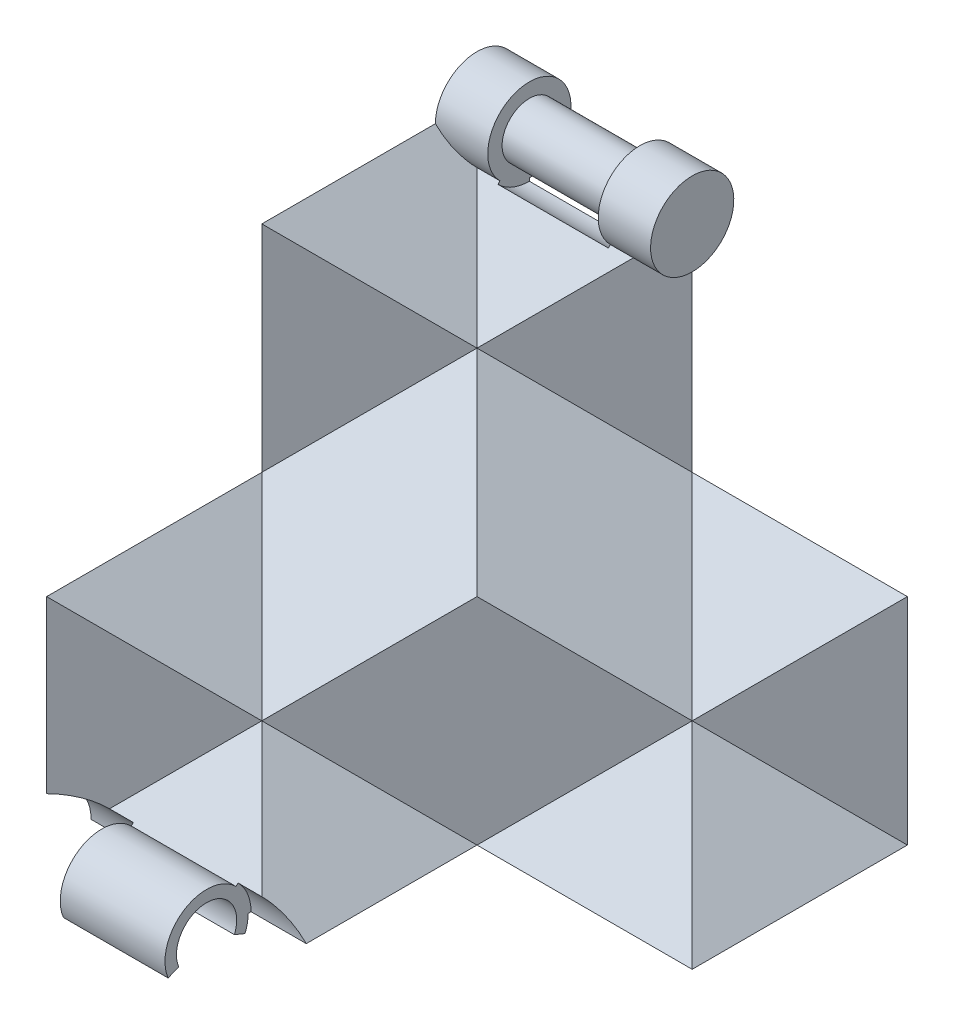
ISO-10303-21;
HEADER;
FILE_DESCRIPTION(('STEP AP214'),'2;1');
FILE_NAME('part.step','',(''),(''),'','','');
FILE_SCHEMA(('AUTOMOTIVE_DESIGN { 1 0 10303 214 1 1 1 1 }'));
ENDSEC;
DATA;
#1=APPLICATION_CONTEXT('core data for automotive mechanical design processes');
#2=APPLICATION_PROTOCOL_DEFINITION('international standard','automotive_design',2000,#1);
#3=PRODUCT_CONTEXT('',#1,'mechanical');
#4=PRODUCT('Part','Part','',(#3));
#5=PRODUCT_RELATED_PRODUCT_CATEGORY('part','',(#4));
#6=PRODUCT_DEFINITION_FORMATION('','',#4);
#7=PRODUCT_DEFINITION_CONTEXT('part definition',#1,'design');
#8=PRODUCT_DEFINITION('design','',#6,#7);
#9=PRODUCT_DEFINITION_SHAPE('','',#8);
#10=(LENGTH_UNIT() NAMED_UNIT(*) SI_UNIT(.MILLI.,.METRE.));
#11=(NAMED_UNIT(*) PLANE_ANGLE_UNIT() SI_UNIT($,.RADIAN.));
#12=(NAMED_UNIT(*) SI_UNIT($,.STERADIAN.) SOLID_ANGLE_UNIT());
#13=UNCERTAINTY_MEASURE_WITH_UNIT(LENGTH_MEASURE(1.E-05),#10,'distance_accuracy_value','');
#14=(GEOMETRIC_REPRESENTATION_CONTEXT(3) GLOBAL_UNCERTAINTY_ASSIGNED_CONTEXT((#13)) GLOBAL_UNIT_ASSIGNED_CONTEXT((#10,
#11,#12)) REPRESENTATION_CONTEXT('',''));
#15=CARTESIAN_POINT('',(0.,0.,0.));
#16=DIRECTION('',(0.,0.,1.));
#17=DIRECTION('',(1.,0.,0.));
#18=AXIS2_PLACEMENT_3D('',#15,#16,#17);
#19=CARTESIAN_POINT('',(0.,0.,0.));
#20=DIRECTION('',(0.,0.,-1.));
#21=DIRECTION('',(-1.,0.,0.));
#22=AXIS2_PLACEMENT_3D('',#19,#20,#21);
#23=PLANE('',#22);
#24=DIRECTION('',(0.,-1.,0.));
#25=VECTOR('',#24,1.);
#26=CARTESIAN_POINT('',(14.4145,0.,0.));
#27=LINE('',#26,#25);
#28=CARTESIAN_POINT('',(14.4145,34.417,0.));
#29=VERTEX_POINT('',#28);
#30=CARTESIAN_POINT('',(14.4145,34.163,0.));
#31=VERTEX_POINT('',#30);
#32=EDGE_CURVE('E594',#29,#31,#27,.T.);
#33=ORIENTED_EDGE('',*,*,#32,.F.);
#34=DIRECTION('',(-1.,0.,0.));
#35=VECTOR('',#34,1.);
#36=CARTESIAN_POINT('',(19.05,34.417,0.));
#37=LINE('',#36,#35);
#38=CARTESIAN_POINT('',(19.05,34.417,0.));
#39=VERTEX_POINT('',#38);
#40=EDGE_CURVE('E69',#29,#39,#37,.F.);
#41=ORIENTED_EDGE('',*,*,#40,.T.);
#42=DIRECTION('',(0.,1.,0.));
#43=VECTOR('',#42,1.);
#44=CARTESIAN_POINT('',(19.05,19.05,0.));
#45=LINE('',#44,#43);
#46=CARTESIAN_POINT('',(19.05,19.05,0.));
#47=VERTEX_POINT('',#46);
#48=EDGE_CURVE('E247',#47,#39,#45,.T.);
#49=ORIENTED_EDGE('',*,*,#48,.F.);
#50=DIRECTION('',(-1.,0.,0.));
#51=VECTOR('',#50,1.);
#52=CARTESIAN_POINT('',(19.05,19.05,0.));
#53=LINE('',#52,#51);
#54=CARTESIAN_POINT('',(38.1,19.05,0.));
#55=VERTEX_POINT('',#54);
#56=EDGE_CURVE('E262',#55,#47,#53,.T.);
#57=ORIENTED_EDGE('',*,*,#56,.F.);
#58=DIRECTION('',(0.,1.,0.));
#59=VECTOR('',#58,1.);
#60=CARTESIAN_POINT('',(38.1,0.,0.));
#61=LINE('',#60,#59);
#62=CARTESIAN_POINT('',(38.1,0.,0.));
#63=VERTEX_POINT('',#62);
#64=EDGE_CURVE('E258',#63,#55,#61,.T.);
#65=ORIENTED_EDGE('',*,*,#64,.F.);
#66=DIRECTION('',(1.,0.,0.));
#67=VECTOR('',#66,1.);
#68=CARTESIAN_POINT('',(0.,0.,0.));
#69=LINE('',#68,#67);
#70=CARTESIAN_POINT('',(0.,0.,0.));
#71=VERTEX_POINT('',#70);
#72=EDGE_CURVE('E299',#71,#63,#69,.T.);
#73=ORIENTED_EDGE('',*,*,#72,.F.);
#74=DIRECTION('',(0.,-1.,0.));
#75=VECTOR('',#74,1.);
#76=CARTESIAN_POINT('',(0.,0.,0.));
#77=LINE('',#76,#75);
#78=CARTESIAN_POINT('',(0.,34.417,0.));
#79=VERTEX_POINT('',#78);
#80=EDGE_CURVE('E296',#79,#71,#77,.T.);
#81=ORIENTED_EDGE('',*,*,#80,.F.);
#82=DIRECTION('',(-1.,0.,0.));
#83=VECTOR('',#82,1.);
#84=CARTESIAN_POINT('',(15.0525971004402,34.417,0.));
#85=LINE('',#84,#83);
#86=CARTESIAN_POINT('',(4.6355,34.417,0.));
#87=VERTEX_POINT('',#86);
#88=EDGE_CURVE('E211',#79,#87,#85,.F.);
#89=ORIENTED_EDGE('',*,*,#88,.T.);
#90=DIRECTION('',(0.,-1.,0.));
#91=VECTOR('',#90,1.);
#92=CARTESIAN_POINT('',(4.6355,0.,0.));
#93=LINE('',#92,#91);
#94=CARTESIAN_POINT('',(4.6355,34.163,0.));
#95=VERTEX_POINT('',#94);
#96=EDGE_CURVE('E600',#87,#95,#93,.T.);
#97=ORIENTED_EDGE('',*,*,#96,.T.);
#98=DIRECTION('',(-1.,0.,0.));
#99=VECTOR('',#98,1.);
#100=CARTESIAN_POINT('',(25.5500175901257,34.163,0.));
#101=LINE('',#100,#99);
#102=EDGE_CURVE('E603',#95,#31,#101,.F.);
#103=ORIENTED_EDGE('',*,*,#102,.T.);
#104=EDGE_LOOP('',(#33,#41,#49,#57,#65,#73,#81,#89,#97,#103));
#105=FACE_BOUND('',#104,.T.);
#106=ADVANCED_FACE('F45',(#105),#23,.T.);
#107=CARTESIAN_POINT('',(0.,38.1,0.));
#108=DIRECTION('',(0.,0.707106781186546,0.707106781186549));
#109=DIRECTION('',(0.,-0.707106781186549,0.707106781186546));
#110=AXIS2_PLACEMENT_3D('',#107,#108,#109);
#111=PLANE('',#110);
#112=DIRECTION('',(-1.,0.,0.));
#113=VECTOR('',#112,1.);
#114=CARTESIAN_POINT('',(19.05,35.49572572489,2.60427427511008));
#115=LINE('',#114,#113);
#116=CARTESIAN_POINT('',(14.4145,35.49572572489,2.60427427511008));
#117=VERTEX_POINT('',#116);
#118=CARTESIAN_POINT('',(16.4457257248899,35.49572572489,2.60427427511009));
#119=VERTEX_POINT('',#118);
#120=EDGE_CURVE('E567',#117,#119,#115,.F.);
#121=ORIENTED_EDGE('',*,*,#120,.F.);
#122=DIRECTION('',(0.,0.707106781186549,-0.707106781186546));
#123=VECTOR('',#122,1.);
#124=CARTESIAN_POINT('',(14.4145,38.1,0.));
#125=LINE('',#124,#123);
#126=CARTESIAN_POINT('',(14.4145,35.3161206024686,2.78387939753146));
#127=VERTEX_POINT('',#126);
#128=EDGE_CURVE('E588',#117,#127,#125,.F.);
#129=ORIENTED_EDGE('',*,*,#128,.T.);
#130=DIRECTION('',(-1.,0.,0.));
#131=VECTOR('',#130,1.);
#132=CARTESIAN_POINT('',(25.5500175901257,35.3161206024686,2.78387939753146));
#133=LINE('',#132,#131);
#134=CARTESIAN_POINT('',(4.6355,35.3161206024686,2.78387939753146));
#135=VERTEX_POINT('',#134);
#136=EDGE_CURVE('E11',#135,#127,#133,.F.);
#137=ORIENTED_EDGE('',*,*,#136,.F.);
#138=DIRECTION('',(0.,0.707106781186549,-0.707106781186546));
#139=VECTOR('',#138,1.);
#140=CARTESIAN_POINT('',(4.6355,38.1,0.));
#141=LINE('',#140,#139);
#142=CARTESIAN_POINT('',(4.6355,35.49572572489,2.60427427511009));
#143=VERTEX_POINT('',#142);
#144=EDGE_CURVE('E597',#143,#135,#141,.F.);
#145=ORIENTED_EDGE('',*,*,#144,.F.);
#146=DIRECTION('',(-1.,0.,0.));
#147=VECTOR('',#146,1.);
#148=CARTESIAN_POINT('',(15.0525971004402,35.49572572489,2.60427427511008));
#149=LINE('',#148,#147);
#150=CARTESIAN_POINT('',(2.60427427511006,35.49572572489,2.60427427511009));
#151=VERTEX_POINT('',#150);
#152=EDGE_CURVE('E226',#151,#143,#149,.F.);
#153=ORIENTED_EDGE('',*,*,#152,.F.);
#154=DIRECTION('',(-0.577350269189627,0.577350269189627,-0.577350269189624));
#155=VECTOR('',#154,1.);
#156=CARTESIAN_POINT('',(6.35000000000001,31.75,6.35000000000003));
#157=LINE('',#156,#155);
#158=CARTESIAN_POINT('',(9.525,28.575,9.525));
#159=VERTEX_POINT('',#158);
#160=EDGE_CURVE('E224',#159,#151,#157,.T.);
#161=ORIENTED_EDGE('',*,*,#160,.F.);
#162=DIRECTION('',(0.577350269189627,0.577350269189627,-0.577350269189624));
#163=VECTOR('',#162,1.);
#164=CARTESIAN_POINT('',(12.7,31.75,6.35000000000003));
#165=LINE('',#164,#163);
#166=EDGE_CURVE('E233',#159,#119,#165,.T.);
#167=ORIENTED_EDGE('',*,*,#166,.T.);
#168=EDGE_LOOP('',(#121,#129,#137,#145,#153,#161,#167));
#169=FACE_BOUND('',#168,.T.);
#170=ADVANCED_FACE('F382',(#169),#111,.T.);
#171=CARTESIAN_POINT('',(19.05,19.05,0.));
#172=DIRECTION('',(0.707106781186546,0.,0.707106781186549));
#173=DIRECTION('',(0.707106781186549,0.,-0.707106781186546));
#174=AXIS2_PLACEMENT_3D('',#171,#172,#173);
#175=PLANE('',#174);
#176=CARTESIAN_POINT('',(19.05,38.1,0.));
#177=DIRECTION('',(0.707106781186546,0.,0.707106781186549));
#178=DIRECTION('',(-0.707106781186549,0.,0.707106781186546));
#179=AXIS2_PLACEMENT_3D('',#176,#177,#178);
#180=ELLIPSE('',#179,5.20854855022012,3.683);
#181=EDGE_CURVE('E61',#119,#39,#180,.T.);
#182=ORIENTED_EDGE('',*,*,#181,.F.);
#183=ORIENTED_EDGE('',*,*,#166,.F.);
#184=DIRECTION('',(0.577350269189627,-0.577350269189626,-0.577350269189625));
#185=VECTOR('',#184,1.);
#186=CARTESIAN_POINT('',(12.7,25.4000000000001,6.35000000000003));
#187=LINE('',#186,#185);
#188=EDGE_CURVE('E238',#159,#47,#187,.T.);
#189=ORIENTED_EDGE('',*,*,#188,.T.);
#190=ORIENTED_EDGE('',*,*,#48,.T.);
#191=EDGE_LOOP('',(#182,#183,#189,#190));
#192=FACE_BOUND('',#191,.T.);
#193=ADVANCED_FACE('F385',(#192),#175,.T.);
#194=CARTESIAN_POINT('',(0.,38.1,19.05));
#195=DIRECTION('',(0.707106781186549,0.707106781186546,0.));
#196=DIRECTION('',(0.707106781186546,-0.707106781186549,0.));
#197=AXIS2_PLACEMENT_3D('',#194,#195,#196);
#198=PLANE('',#197);
#199=CARTESIAN_POINT('',(0.,38.1,0.));
#200=DIRECTION('',(0.707106781186549,0.707106781186546,0.));
#201=DIRECTION('',(-0.707106781186546,0.707106781186549,0.));
#202=AXIS2_PLACEMENT_3D('',#199,#200,#201);
#203=ELLIPSE('',#202,5.2085485502201,3.683);
#204=CARTESIAN_POINT('',(0.,38.1,3.68300000000003));
#205=VERTEX_POINT('',#204);
#206=EDGE_CURVE('E208',#205,#151,#203,.T.);
#207=ORIENTED_EDGE('',*,*,#206,.F.);
#208=DIRECTION('',(0.,0.,1.));
#209=VECTOR('',#208,1.);
#210=CARTESIAN_POINT('',(0.,38.1,19.05));
#211=LINE('',#210,#209);
#212=CARTESIAN_POINT('',(0.,38.1,19.05));
#213=VERTEX_POINT('',#212);
#214=EDGE_CURVE('E221',#205,#213,#211,.T.);
#215=ORIENTED_EDGE('',*,*,#214,.T.);
#216=DIRECTION('',(-0.577350269189622,0.577350269189627,0.577350269189629));
#217=VECTOR('',#216,1.);
#218=CARTESIAN_POINT('',(6.35000000000004,31.75,12.7));
#219=LINE('',#218,#217);
#220=EDGE_CURVE('E263',#159,#213,#219,.T.);
#221=ORIENTED_EDGE('',*,*,#220,.F.);
#222=ORIENTED_EDGE('',*,*,#160,.T.);
#223=EDGE_LOOP('',(#207,#215,#221,#222));
#224=FACE_BOUND('',#223,.T.);
#225=ADVANCED_FACE('F220',(#224),#198,.T.);
#226=CARTESIAN_POINT('',(0.,0.,38.1));
#227=DIRECTION('',(0.,0.707106781186551,0.707106781186544));
#228=DIRECTION('',(0.,-0.707106781186544,0.707106781186551));
#229=AXIS2_PLACEMENT_3D('',#226,#227,#228);
#230=PLANE('',#229);
#231=DIRECTION('',(-1.,0.,0.));
#232=VECTOR('',#231,1.);
#233=CARTESIAN_POINT('',(19.05,2.78387939753149,35.3161206024685));
#234=LINE('',#233,#232);
#235=CARTESIAN_POINT('',(16.2661206024686,2.78387939753149,35.3161206024685));
#236=VERTEX_POINT('',#235);
#237=CARTESIAN_POINT('',(14.1605,2.78387939753149,35.3161206024685));
#238=VERTEX_POINT('',#237);
#239=EDGE_CURVE('E349',#236,#238,#234,.T.);
#240=ORIENTED_EDGE('',*,*,#239,.F.);
#241=DIRECTION('',(0.577350269189627,-0.577350269189622,0.577350269189629));
#242=VECTOR('',#241,1.);
#243=CARTESIAN_POINT('',(19.05,0.,38.1));
#244=LINE('',#243,#242);
#245=CARTESIAN_POINT('',(9.525,9.525,28.575));
#246=VERTEX_POINT('',#245);
#247=EDGE_CURVE('E317',#246,#236,#244,.T.);
#248=ORIENTED_EDGE('',*,*,#247,.F.);
#249=DIRECTION('',(-0.577350269189627,-0.577350269189622,0.577350269189629));
#250=VECTOR('',#249,1.);
#251=CARTESIAN_POINT('',(0.,0.,38.1));
#252=LINE('',#251,#250);
#253=CARTESIAN_POINT('',(2.78387939753145,2.7838793975315,35.3161206024685));
#254=VERTEX_POINT('',#253);
#255=EDGE_CURVE('E323',#246,#254,#252,.T.);
#256=ORIENTED_EDGE('',*,*,#255,.T.);
#257=DIRECTION('',(-1.,0.,0.));
#258=VECTOR('',#257,1.);
#259=CARTESIAN_POINT('',(16.0250175901257,2.78387939753149,35.3161206024685));
#260=LINE('',#259,#258);
#261=CARTESIAN_POINT('',(4.8895,2.78387939753149,35.3161206024685));
#262=VERTEX_POINT('',#261);
#263=EDGE_CURVE('E428',#262,#254,#260,.T.);
#264=ORIENTED_EDGE('',*,*,#263,.F.);
#265=DIRECTION('',(0.,0.707106781186544,-0.707106781186551));
#266=VECTOR('',#265,1.);
#267=CARTESIAN_POINT('',(4.8895,0.,38.1));
#268=LINE('',#267,#266);
#269=CARTESIAN_POINT('',(4.8895,2.60427427511011,35.4957257248899));
#270=VERTEX_POINT('',#269);
#271=EDGE_CURVE('E432',#262,#270,#268,.F.);
#272=ORIENTED_EDGE('',*,*,#271,.T.);
#273=DIRECTION('',(-1.,0.,0.));
#274=VECTOR('',#273,1.);
#275=CARTESIAN_POINT('',(14.1605,2.60427427511011,35.4957257248899));
#276=LINE('',#275,#274);
#277=CARTESIAN_POINT('',(14.1605,2.60427427511011,35.4957257248899));
#278=VERTEX_POINT('',#277);
#279=EDGE_CURVE('E252',#278,#270,#276,.T.);
#280=ORIENTED_EDGE('',*,*,#279,.F.);
#281=DIRECTION('',(0.,0.707106781186544,-0.707106781186551));
#282=VECTOR('',#281,1.);
#283=CARTESIAN_POINT('',(14.1605,0.,38.1));
#284=LINE('',#283,#282);
#285=EDGE_CURVE('E361',#238,#278,#284,.F.);
#286=ORIENTED_EDGE('',*,*,#285,.F.);
#287=EDGE_LOOP('',(#240,#248,#256,#264,#272,#280,#286));
#288=FACE_BOUND('',#287,.T.);
#289=ADVANCED_FACE('F358',(#288),#230,.T.);
#290=CARTESIAN_POINT('',(0.,0.,38.1));
#291=DIRECTION('',(0.,-1.,0.));
#292=DIRECTION('',(-1.,0.,0.));
#293=AXIS2_PLACEMENT_3D('',#290,#291,#292);
#294=PLANE('',#293);
#295=DIRECTION('',(0.,0.,-1.));
#296=VECTOR('',#295,1.);
#297=CARTESIAN_POINT('',(19.05,0.,38.1));
#298=LINE('',#297,#296);
#299=CARTESIAN_POINT('',(19.05,0.,34.163));
#300=VERTEX_POINT('',#299);
#301=CARTESIAN_POINT('',(19.05,0.,19.05));
#302=VERTEX_POINT('',#301);
#303=EDGE_CURVE('E307',#300,#302,#298,.T.);
#304=ORIENTED_EDGE('',*,*,#303,.F.);
#305=DIRECTION('',(-1.,0.,0.));
#306=VECTOR('',#305,1.);
#307=CARTESIAN_POINT('',(19.05,0.,34.163));
#308=LINE('',#307,#306);
#309=CARTESIAN_POINT('',(14.1605,0.,34.163));
#310=VERTEX_POINT('',#309);
#311=EDGE_CURVE('E352',#300,#310,#308,.T.);
#312=ORIENTED_EDGE('',*,*,#311,.T.);
#313=DIRECTION('',(0.,0.,1.));
#314=VECTOR('',#313,1.);
#315=CARTESIAN_POINT('',(14.1605,0.,38.1));
#316=LINE('',#315,#314);
#317=CARTESIAN_POINT('',(14.1605,0.,34.417));
#318=VERTEX_POINT('',#317);
#319=EDGE_CURVE('E618',#310,#318,#316,.T.);
#320=ORIENTED_EDGE('',*,*,#319,.T.);
#321=DIRECTION('',(-1.,0.,0.));
#322=VECTOR('',#321,1.);
#323=CARTESIAN_POINT('',(14.1605,0.,34.417));
#324=LINE('',#323,#322);
#325=CARTESIAN_POINT('',(4.8895,0.,34.417));
#326=VERTEX_POINT('',#325);
#327=EDGE_CURVE('E340',#318,#326,#324,.T.);
#328=ORIENTED_EDGE('',*,*,#327,.T.);
#329=DIRECTION('',(0.,0.,1.));
#330=VECTOR('',#329,1.);
#331=CARTESIAN_POINT('',(4.8895,0.,38.1));
#332=LINE('',#331,#330);
#333=CARTESIAN_POINT('',(4.8895,0.,34.163));
#334=VERTEX_POINT('',#333);
#335=EDGE_CURVE('E429',#334,#326,#332,.T.);
#336=ORIENTED_EDGE('',*,*,#335,.F.);
#337=DIRECTION('',(-1.,0.,0.));
#338=VECTOR('',#337,1.);
#339=CARTESIAN_POINT('',(16.0250175901257,0.,34.163));
#340=LINE('',#339,#338);
#341=CARTESIAN_POINT('',(0.,0.,34.163));
#342=VERTEX_POINT('',#341);
#343=EDGE_CURVE('E436',#334,#342,#340,.T.);
#344=ORIENTED_EDGE('',*,*,#343,.T.);
#345=DIRECTION('',(0.,0.,1.));
#346=VECTOR('',#345,1.);
#347=CARTESIAN_POINT('',(0.,0.,38.1));
#348=LINE('',#347,#346);
#349=EDGE_CURVE('E313',#71,#342,#348,.T.);
#350=ORIENTED_EDGE('',*,*,#349,.F.);
#351=ORIENTED_EDGE('',*,*,#72,.T.);
#352=DIRECTION('',(0.,0.,-1.));
#353=VECTOR('',#352,1.);
#354=CARTESIAN_POINT('',(38.1,0.,19.05));
#355=LINE('',#354,#353);
#356=CARTESIAN_POINT('',(38.1,0.,19.05));
#357=VERTEX_POINT('',#356);
#358=EDGE_CURVE('E271',#357,#63,#355,.T.);
#359=ORIENTED_EDGE('',*,*,#358,.F.);
#360=DIRECTION('',(1.,0.,0.));
#361=VECTOR('',#360,1.);
#362=CARTESIAN_POINT('',(19.05,0.,19.05));
#363=LINE('',#362,#361);
#364=EDGE_CURVE('E278',#302,#357,#363,.T.);
#365=ORIENTED_EDGE('',*,*,#364,.F.);
#366=EDGE_LOOP('',(#304,#312,#320,#328,#336,#344,#350,#351,#359,#365));
#367=FACE_BOUND('',#366,.T.);
#368=ADVANCED_FACE('F407',(#367),#294,.T.);
#369=CARTESIAN_POINT('',(19.05,0.,38.1));
#370=DIRECTION('',(0.707106781186546,0.707106781186549,0.));
#371=DIRECTION('',(0.707106781186549,-0.707106781186546,0.));
#372=AXIS2_PLACEMENT_3D('',#369,#370,#371);
#373=PLANE('',#372);
#374=CARTESIAN_POINT('',(19.05,0.,38.1));
#375=DIRECTION('',(0.707106781186546,0.707106781186549,0.));
#376=DIRECTION('',(-0.707106781186549,0.707106781186546,0.));
#377=AXIS2_PLACEMENT_3D('',#374,#375,#376);
#378=ELLIPSE('',#377,5.56775879506288,3.93699999999999);
#379=EDGE_CURVE('E54',#300,#236,#378,.T.);
#380=ORIENTED_EDGE('',*,*,#379,.F.);
#381=ORIENTED_EDGE('',*,*,#303,.T.);
#382=DIRECTION('',(0.577350269189627,-0.577350269189626,-0.577350269189625));
#383=VECTOR('',#382,1.);
#384=CARTESIAN_POINT('',(12.7,6.35000000000002,25.4));
#385=LINE('',#384,#383);
#386=EDGE_CURVE('E318',#246,#302,#385,.T.);
#387=ORIENTED_EDGE('',*,*,#386,.F.);
#388=ORIENTED_EDGE('',*,*,#247,.T.);
#389=EDGE_LOOP('',(#380,#381,#387,#388));
#390=FACE_BOUND('',#389,.T.);
#391=ADVANCED_FACE('F365',(#390),#373,.T.);
#392=CARTESIAN_POINT('',(0.,0.,38.1));
#393=DIRECTION('',(0.707106781186551,0.,0.707106781186544));
#394=DIRECTION('',(0.707106781186544,0.,-0.707106781186551));
#395=AXIS2_PLACEMENT_3D('',#392,#393,#394);
#396=PLANE('',#395);
#397=CARTESIAN_POINT('',(0.,0.,38.1));
#398=DIRECTION('',(0.707106781186551,0.,0.707106781186544));
#399=DIRECTION('',(-0.707106781186544,0.,0.707106781186551));
#400=AXIS2_PLACEMENT_3D('',#397,#398,#399);
#401=ELLIPSE('',#400,5.56775879506284,3.93699999999999);
#402=CARTESIAN_POINT('',(0.,3.93700000000007,38.1));
#403=VERTEX_POINT('',#402);
#404=EDGE_CURVE('E423',#254,#403,#401,.T.);
#405=ORIENTED_EDGE('',*,*,#404,.F.);
#406=ORIENTED_EDGE('',*,*,#255,.F.);
#407=DIRECTION('',(-0.577350269189622,0.577350269189627,0.577350269189629));
#408=VECTOR('',#407,1.);
#409=CARTESIAN_POINT('',(6.35000000000004,12.7,31.75));
#410=LINE('',#409,#408);
#411=CARTESIAN_POINT('',(0.,19.05,38.1));
#412=VERTEX_POINT('',#411);
#413=EDGE_CURVE('E337',#246,#412,#410,.T.);
#414=ORIENTED_EDGE('',*,*,#413,.T.);
#415=DIRECTION('',(0.,-1.,0.));
#416=VECTOR('',#415,1.);
#417=CARTESIAN_POINT('',(0.,0.,38.1));
#418=LINE('',#417,#416);
#419=EDGE_CURVE('E333',#412,#403,#418,.T.);
#420=ORIENTED_EDGE('',*,*,#419,.T.);
#421=EDGE_LOOP('',(#405,#406,#414,#420));
#422=FACE_BOUND('',#421,.T.);
#423=ADVANCED_FACE('F404',(#422),#396,.T.);
#424=CARTESIAN_POINT('',(19.05,0.,19.05));
#425=DIRECTION('',(0.707106781186546,0.,0.707106781186549));
#426=DIRECTION('',(0.707106781186549,0.,-0.707106781186546));
#427=AXIS2_PLACEMENT_3D('',#424,#425,#426);
#428=PLANE('',#427);
#429=ORIENTED_EDGE('',*,*,#386,.T.);
#430=DIRECTION('',(-0.577350269189627,-0.577350269189622,0.577350269189629));
#431=VECTOR('',#430,1.);
#432=CARTESIAN_POINT('',(19.05,0.,19.05));
#433=LINE('',#432,#431);
#434=CARTESIAN_POINT('',(28.575,9.525,9.525));
#435=VERTEX_POINT('',#434);
#436=EDGE_CURVE('E288',#435,#302,#433,.T.);
#437=ORIENTED_EDGE('',*,*,#436,.F.);
#438=DIRECTION('',(-0.577350269189622,0.577350269189627,0.577350269189629));
#439=VECTOR('',#438,1.);
#440=CARTESIAN_POINT('',(25.4000000000001,12.7,12.7));
#441=LINE('',#440,#439);
#442=CARTESIAN_POINT('',(19.05,19.05,19.05));
#443=VERTEX_POINT('',#442);
#444=EDGE_CURVE('E287',#435,#443,#441,.T.);
#445=ORIENTED_EDGE('',*,*,#444,.T.);
#446=DIRECTION('',(0.577350269189627,0.577350269189627,-0.577350269189624));
#447=VECTOR('',#446,1.);
#448=CARTESIAN_POINT('',(12.7,12.7,25.4));
#449=LINE('',#448,#447);
#450=EDGE_CURVE('E303',#246,#443,#449,.T.);
#451=ORIENTED_EDGE('',*,*,#450,.F.);
#452=EDGE_LOOP('',(#429,#437,#445,#451));
#453=FACE_BOUND('',#452,.T.);
#454=ADVANCED_FACE('F375',(#453),#428,.T.);
#455=CARTESIAN_POINT('',(0.,19.05,19.05));
#456=DIRECTION('',(0.,0.707106781186546,0.707106781186549));
#457=DIRECTION('',(0.,-0.707106781186549,0.707106781186546));
#458=AXIS2_PLACEMENT_3D('',#455,#456,#457);
#459=PLANE('',#458);
#460=ORIENTED_EDGE('',*,*,#450,.T.);
#461=DIRECTION('',(0.577350269189627,-0.577350269189622,0.577350269189629));
#462=VECTOR('',#461,1.);
#463=CARTESIAN_POINT('',(19.05,19.0500000000001,19.05));
#464=LINE('',#463,#462);
#465=EDGE_CURVE('E248',#159,#443,#464,.T.);
#466=ORIENTED_EDGE('',*,*,#465,.F.);
#467=DIRECTION('',(-0.577350269189627,-0.577350269189622,0.577350269189629));
#468=VECTOR('',#467,1.);
#469=CARTESIAN_POINT('',(0.,19.0500000000001,19.05));
#470=LINE('',#469,#468);
#471=CARTESIAN_POINT('',(0.,19.05,19.05));
#472=VERTEX_POINT('',#471);
#473=EDGE_CURVE('E243',#159,#472,#470,.T.);
#474=ORIENTED_EDGE('',*,*,#473,.T.);
#475=DIRECTION('',(-0.577350269189627,0.577350269189627,-0.577350269189624));
#476=VECTOR('',#475,1.);
#477=CARTESIAN_POINT('',(6.35000000000002,12.7,25.4));
#478=LINE('',#477,#476);
#479=EDGE_CURVE('E302',#246,#472,#478,.T.);
#480=ORIENTED_EDGE('',*,*,#479,.F.);
#481=EDGE_LOOP('',(#460,#466,#474,#480));
#482=FACE_BOUND('',#481,.T.);
#483=ADVANCED_FACE('F371',(#482),#459,.T.);
#484=CARTESIAN_POINT('',(0.,19.05,38.1));
#485=DIRECTION('',(0.707106781186549,0.707106781186546,0.));
#486=DIRECTION('',(0.707106781186546,-0.707106781186549,0.));
#487=AXIS2_PLACEMENT_3D('',#484,#485,#486);
#488=PLANE('',#487);
#489=DIRECTION('',(0.,0.,1.));
#490=VECTOR('',#489,1.);
#491=CARTESIAN_POINT('',(0.,19.05,38.1));
#492=LINE('',#491,#490);
#493=EDGE_CURVE('E322',#472,#412,#492,.T.);
#494=ORIENTED_EDGE('',*,*,#493,.T.);
#495=ORIENTED_EDGE('',*,*,#413,.F.);
#496=ORIENTED_EDGE('',*,*,#479,.T.);
#497=EDGE_LOOP('',(#494,#495,#496));
#498=FACE_BOUND('',#497,.T.);
#499=ADVANCED_FACE('F47',(#498),#488,.T.);
#500=CARTESIAN_POINT('',(0.,0.,38.1));
#501=DIRECTION('',(-1.,0.,0.));
#502=DIRECTION('',(0.,0.,1.));
#503=AXIS2_PLACEMENT_3D('',#500,#501,#502);
#504=PLANE('',#503);
#505=CARTESIAN_POINT('',(0.,38.1,0.));
#506=DIRECTION('',(1.,0.,0.));
#507=DIRECTION('',(0.,0.,-1.));
#508=AXIS2_PLACEMENT_3D('',#505,#506,#507);
#509=CIRCLE('',#508,3.683);
#510=EDGE_CURVE('E205',#79,#205,#509,.T.);
#511=ORIENTED_EDGE('',*,*,#510,.F.);
#512=ORIENTED_EDGE('',*,*,#80,.T.);
#513=ORIENTED_EDGE('',*,*,#349,.T.);
#514=CARTESIAN_POINT('',(0.,0.,38.1));
#515=DIRECTION('',(1.,0.,0.));
#516=DIRECTION('',(0.,0.,-1.));
#517=AXIS2_PLACEMENT_3D('',#514,#515,#516);
#518=CIRCLE('',#517,3.93699999999999);
#519=EDGE_CURVE('E363',#342,#403,#518,.T.);
#520=ORIENTED_EDGE('',*,*,#519,.T.);
#521=ORIENTED_EDGE('',*,*,#419,.F.);
#522=ORIENTED_EDGE('',*,*,#493,.F.);
#523=DIRECTION('',(0.,-1.,0.));
#524=VECTOR('',#523,1.);
#525=CARTESIAN_POINT('',(0.,19.05,19.05));
#526=LINE('',#525,#524);
#527=EDGE_CURVE('E231',#213,#472,#526,.T.);
#528=ORIENTED_EDGE('',*,*,#527,.F.);
#529=ORIENTED_EDGE('',*,*,#214,.F.);
#530=EDGE_LOOP('',(#511,#512,#513,#520,#521,#522,#528,#529));
#531=FACE_BOUND('',#530,.T.);
#532=ADVANCED_FACE('F229',(#531),#504,.T.);
#533=CARTESIAN_POINT('',(38.1,0.,19.05));
#534=DIRECTION('',(0.707106781186546,0.707106781186549,0.));
#535=DIRECTION('',(0.707106781186549,-0.707106781186546,0.));
#536=AXIS2_PLACEMENT_3D('',#533,#534,#535);
#537=PLANE('',#536);
#538=ORIENTED_EDGE('',*,*,#358,.T.);
#539=DIRECTION('',(0.577350269189627,-0.577350269189626,-0.577350269189625));
#540=VECTOR('',#539,1.);
#541=CARTESIAN_POINT('',(31.75,6.35000000000002,6.35000000000003));
#542=LINE('',#541,#540);
#543=EDGE_CURVE('E283',#435,#63,#542,.T.);
#544=ORIENTED_EDGE('',*,*,#543,.F.);
#545=DIRECTION('',(0.577350269189627,-0.577350269189622,0.577350269189629));
#546=VECTOR('',#545,1.);
#547=CARTESIAN_POINT('',(38.1,0.,19.05));
#548=LINE('',#547,#546);
#549=EDGE_CURVE('E282',#435,#357,#548,.T.);
#550=ORIENTED_EDGE('',*,*,#549,.T.);
#551=EDGE_LOOP('',(#538,#544,#550));
#552=FACE_BOUND('',#551,.T.);
#553=ADVANCED_FACE('F416',(#552),#537,.T.);
#554=CARTESIAN_POINT('',(19.05,0.,19.05));
#555=DIRECTION('',(0.,0.707106781186551,0.707106781186544));
#556=DIRECTION('',(0.,-0.707106781186544,0.707106781186551));
#557=AXIS2_PLACEMENT_3D('',#554,#555,#556);
#558=PLANE('',#557);
#559=ORIENTED_EDGE('',*,*,#364,.T.);
#560=ORIENTED_EDGE('',*,*,#549,.F.);
#561=ORIENTED_EDGE('',*,*,#436,.T.);
#562=EDGE_LOOP('',(#559,#560,#561));
#563=FACE_BOUND('',#562,.T.);
#564=ADVANCED_FACE('F677',(#563),#558,.T.);
#565=CARTESIAN_POINT('',(38.1,0.,0.));
#566=DIRECTION('',(0.707106781186546,0.,0.707106781186549));
#567=DIRECTION('',(0.707106781186549,0.,-0.707106781186546));
#568=AXIS2_PLACEMENT_3D('',#565,#566,#567);
#569=PLANE('',#568);
#570=ORIENTED_EDGE('',*,*,#64,.T.);
#571=DIRECTION('',(0.577350269189627,0.577350269189627,-0.577350269189624));
#572=VECTOR('',#571,1.);
#573=CARTESIAN_POINT('',(31.75,12.7,6.35000000000003));
#574=LINE('',#573,#572);
#575=EDGE_CURVE('E267',#435,#55,#574,.T.);
#576=ORIENTED_EDGE('',*,*,#575,.F.);
#577=ORIENTED_EDGE('',*,*,#543,.T.);
#578=EDGE_LOOP('',(#570,#576,#577));
#579=FACE_BOUND('',#578,.T.);
#580=ADVANCED_FACE('F659',(#579),#569,.T.);
#581=CARTESIAN_POINT('',(19.05,19.05,0.));
#582=DIRECTION('',(0.,0.707106781186546,0.707106781186549));
#583=DIRECTION('',(0.,-0.707106781186549,0.707106781186546));
#584=AXIS2_PLACEMENT_3D('',#581,#582,#583);
#585=PLANE('',#584);
#586=ORIENTED_EDGE('',*,*,#56,.T.);
#587=DIRECTION('',(-0.577350269189627,0.577350269189627,-0.577350269189624));
#588=VECTOR('',#587,1.);
#589=CARTESIAN_POINT('',(25.4000000000001,12.7,6.35000000000003));
#590=LINE('',#589,#588);
#591=EDGE_CURVE('E266',#435,#47,#590,.T.);
#592=ORIENTED_EDGE('',*,*,#591,.F.);
#593=ORIENTED_EDGE('',*,*,#575,.T.);
#594=EDGE_LOOP('',(#586,#592,#593));
#595=FACE_BOUND('',#594,.T.);
#596=ADVANCED_FACE('F505',(#595),#585,.T.);
#597=CARTESIAN_POINT('',(19.0500000000001,19.05,19.05));
#598=DIRECTION('',(0.707106781186549,0.707106781186546,0.));
#599=DIRECTION('',(0.707106781186546,-0.707106781186549,0.));
#600=AXIS2_PLACEMENT_3D('',#597,#598,#599);
#601=PLANE('',#600);
#602=ORIENTED_EDGE('',*,*,#591,.T.);
#603=ORIENTED_EDGE('',*,*,#188,.F.);
#604=ORIENTED_EDGE('',*,*,#465,.T.);
#605=ORIENTED_EDGE('',*,*,#444,.F.);
#606=EDGE_LOOP('',(#602,#603,#604,#605));
#607=FACE_BOUND('',#606,.T.);
#608=ADVANCED_FACE('F379',(#607),#601,.T.);
#609=CARTESIAN_POINT('',(0.,19.05,19.05));
#610=DIRECTION('',(0.707106781186551,0.,0.707106781186544));
#611=DIRECTION('',(0.707106781186544,0.,-0.707106781186551));
#612=AXIS2_PLACEMENT_3D('',#609,#610,#611);
#613=PLANE('',#612);
#614=ORIENTED_EDGE('',*,*,#527,.T.);
#615=ORIENTED_EDGE('',*,*,#473,.F.);
#616=ORIENTED_EDGE('',*,*,#220,.T.);
#617=EDGE_LOOP('',(#614,#615,#616));
#618=FACE_BOUND('',#617,.T.);
#619=ADVANCED_FACE('F494',(#618),#613,.T.);
#620=CARTESIAN_POINT('',(14.1605,-13.4703841816037,5.57961581839627));
#621=DIRECTION('',(0.,-0.923879532511286,0.382683432365091));
#622=DIRECTION('',(0.,-0.382683432365091,-0.923879532511286));
#623=AXIS2_PLACEMENT_3D('',#620,#621,#622);
#624=PLANE('',#623);
#625=DIRECTION('',(0.,0.382683432365091,0.923879532511286));
#626=VECTOR('',#625,1.);
#627=CARTESIAN_POINT('',(4.8895,-13.4703841816037,5.57961581839627));
#628=LINE('',#627,#626);
#629=CARTESIAN_POINT('',(4.8895,-1.40942308140056,34.6973516817609));
#630=VERTEX_POINT('',#629);
#631=CARTESIAN_POINT('',(4.8895,-1.02061671411762,35.6360132867924));
#632=VERTEX_POINT('',#631);
#633=EDGE_CURVE('E440',#630,#632,#628,.T.);
#634=ORIENTED_EDGE('',*,*,#633,.F.);
#635=DIRECTION('',(-1.,0.,0.));
#636=VECTOR('',#635,1.);
#637=CARTESIAN_POINT('',(14.1605,-1.40942308140056,34.6973516817609));
#638=LINE('',#637,#636);
#639=CARTESIAN_POINT('',(14.1605,-1.40942308140056,34.6973516817609));
#640=VERTEX_POINT('',#639);
#641=EDGE_CURVE('E487',#640,#630,#638,.T.);
#642=ORIENTED_EDGE('',*,*,#641,.F.);
#643=DIRECTION('',(0.,0.382683432365091,0.923879532511286));
#644=VECTOR('',#643,1.);
#645=CARTESIAN_POINT('',(14.1605,-13.4703841816037,5.57961581839627));
#646=LINE('',#645,#644);
#647=CARTESIAN_POINT('',(14.1605,-1.02061671411762,35.6360132867924));
#648=VERTEX_POINT('',#647);
#649=EDGE_CURVE('E444',#640,#648,#646,.T.);
#650=ORIENTED_EDGE('',*,*,#649,.T.);
#651=DIRECTION('',(-1.,0.,0.));
#652=VECTOR('',#651,1.);
#653=CARTESIAN_POINT('',(14.1605,-1.02061671411762,35.6360132867924));
#654=LINE('',#653,#652);
#655=EDGE_CURVE('E461',#648,#632,#654,.T.);
#656=ORIENTED_EDGE('',*,*,#655,.T.);
#657=EDGE_LOOP('',(#634,#642,#650,#656));
#658=FACE_BOUND('',#657,.T.);
#659=ADVANCED_FACE('F496',(#658),#624,.T.);
#660=CARTESIAN_POINT('',(14.1605,0.,38.1));
#661=DIRECTION('',(-1.,0.,0.));
#662=DIRECTION('',(0.,0.,1.));
#663=AXIS2_PLACEMENT_3D('',#660,#661,#662);
#664=CYLINDRICAL_SURFACE('',#663,3.683);
#665=ORIENTED_EDGE('',*,*,#327,.F.);
#666=CARTESIAN_POINT('',(14.1605,0.,38.1));
#667=DIRECTION('',(1.,0.,0.));
#668=DIRECTION('',(0.,0.,-1.));
#669=AXIS2_PLACEMENT_3D('',#666,#667,#668);
#670=CIRCLE('',#669,3.683);
#671=EDGE_CURVE('E450',#640,#318,#670,.T.);
#672=ORIENTED_EDGE('',*,*,#671,.F.);
#673=ORIENTED_EDGE('',*,*,#641,.T.);
#674=CARTESIAN_POINT('',(4.8895,0.,38.1));
#675=DIRECTION('',(1.,0.,0.));
#676=DIRECTION('',(0.,0.,-1.));
#677=AXIS2_PLACEMENT_3D('',#674,#675,#676);
#678=CIRCLE('',#677,3.683);
#679=EDGE_CURVE('E466',#630,#326,#678,.T.);
#680=ORIENTED_EDGE('',*,*,#679,.T.);
#681=EDGE_LOOP('',(#665,#672,#673,#680));
#682=FACE_BOUND('',#681,.T.);
#683=ADVANCED_FACE('F502',(#682),#664,.T.);
#684=CARTESIAN_POINT('',(14.1605,-1.40942308140054,41.5026483182391));
#685=VERTEX_POINT('',#684);
#686=EDGE_CURVE('E448',#278,#685,#670,.T.);
#687=ORIENTED_EDGE('',*,*,#686,.F.);
#688=ORIENTED_EDGE('',*,*,#279,.T.);
#689=CARTESIAN_POINT('',(4.8895,-1.40942308140054,41.5026483182391));
#690=VERTEX_POINT('',#689);
#691=EDGE_CURVE('E465',#270,#690,#678,.T.);
#692=ORIENTED_EDGE('',*,*,#691,.T.);
#693=DIRECTION('',(-1.,0.,0.));
#694=VECTOR('',#693,1.);
#695=CARTESIAN_POINT('',(14.1605,-1.40942308140054,41.5026483182391));
#696=LINE('',#695,#694);
#697=EDGE_CURVE('E483',#685,#690,#696,.T.);
#698=ORIENTED_EDGE('',*,*,#697,.F.);
#699=EDGE_LOOP('',(#687,#688,#692,#698));
#700=FACE_BOUND('',#699,.T.);
#701=ADVANCED_FACE('F509',(#700),#664,.T.);
#702=CARTESIAN_POINT('',(14.1605,0.,38.1));
#703=DIRECTION('',(-1.,0.,0.));
#704=DIRECTION('',(0.,0.,1.));
#705=AXIS2_PLACEMENT_3D('',#702,#703,#704);
#706=CYLINDRICAL_SURFACE('',#705,2.667);
#707=CARTESIAN_POINT('',(4.8895,0.,38.1));
#708=DIRECTION('',(1.,0.,0.));
#709=DIRECTION('',(0.,0.,-1.));
#710=AXIS2_PLACEMENT_3D('',#707,#708,#709);
#711=CIRCLE('',#710,2.667);
#712=CARTESIAN_POINT('',(4.8895,-1.02061671411761,40.5639867132076));
#713=VERTEX_POINT('',#712);
#714=EDGE_CURVE('E449',#632,#713,#711,.T.);
#715=ORIENTED_EDGE('',*,*,#714,.F.);
#716=ORIENTED_EDGE('',*,*,#655,.F.);
#717=CARTESIAN_POINT('',(14.1605,0.,38.1));
#718=DIRECTION('',(1.,0.,0.));
#719=DIRECTION('',(0.,0.,-1.));
#720=AXIS2_PLACEMENT_3D('',#717,#718,#719);
#721=CIRCLE('',#720,2.667);
#722=CARTESIAN_POINT('',(14.1605,-1.02061671411761,40.5639867132076));
#723=VERTEX_POINT('',#722);
#724=EDGE_CURVE('E458',#648,#723,#721,.T.);
#725=ORIENTED_EDGE('',*,*,#724,.T.);
#726=DIRECTION('',(-1.,0.,0.));
#727=VECTOR('',#726,1.);
#728=CARTESIAN_POINT('',(14.1605,-1.02061671411761,40.5639867132076));
#729=LINE('',#728,#727);
#730=EDGE_CURVE('E479',#723,#713,#729,.T.);
#731=ORIENTED_EDGE('',*,*,#730,.T.);
#732=EDGE_LOOP('',(#715,#716,#725,#731));
#733=FACE_BOUND('',#732,.T.);
#734=ADVANCED_FACE('F517',(#733),#706,.F.);
#735=CARTESIAN_POINT('',(14.1605,0.,0.));
#736=DIRECTION('',(1.,0.,0.));
#737=DIRECTION('',(0.,0.,-1.));
#738=AXIS2_PLACEMENT_3D('',#735,#736,#737);
#739=PLANE('',#738);
#740=ORIENTED_EDGE('',*,*,#724,.F.);
#741=ORIENTED_EDGE('',*,*,#649,.F.);
#742=ORIENTED_EDGE('',*,*,#671,.T.);
#743=ORIENTED_EDGE('',*,*,#319,.F.);
#744=CARTESIAN_POINT('',(14.1605,0.,38.1));
#745=DIRECTION('',(1.,0.,0.));
#746=DIRECTION('',(0.,0.,-1.));
#747=AXIS2_PLACEMENT_3D('',#744,#745,#746);
#748=CIRCLE('',#747,3.93699999999999);
#749=EDGE_CURVE('E612',#310,#238,#748,.T.);
#750=ORIENTED_EDGE('',*,*,#749,.T.);
#751=ORIENTED_EDGE('',*,*,#285,.T.);
#752=ORIENTED_EDGE('',*,*,#686,.T.);
#753=DIRECTION('',(0.,0.382683432365084,-0.923879532511289));
#754=VECTOR('',#753,1.);
#755=CARTESIAN_POINT('',(14.1605,13.4703841816036,5.57961581839612));
#756=LINE('',#755,#754);
#757=EDGE_CURVE('E454',#685,#723,#756,.T.);
#758=ORIENTED_EDGE('',*,*,#757,.T.);
#759=EDGE_LOOP('',(#740,#741,#742,#743,#750,#751,#752,#758));
#760=FACE_BOUND('',#759,.T.);
#761=ADVANCED_FACE('F520',(#760),#739,.T.);
#762=CARTESIAN_POINT('',(4.8895,0.,0.));
#763=DIRECTION('',(1.,0.,0.));
#764=DIRECTION('',(0.,0.,-1.));
#765=AXIS2_PLACEMENT_3D('',#762,#763,#764);
#766=PLANE('',#765);
#767=ORIENTED_EDGE('',*,*,#691,.F.);
#768=ORIENTED_EDGE('',*,*,#271,.F.);
#769=CARTESIAN_POINT('',(4.8895,0.,38.1));
#770=DIRECTION('',(1.,0.,0.));
#771=DIRECTION('',(0.,0.,-1.));
#772=AXIS2_PLACEMENT_3D('',#769,#770,#771);
#773=CIRCLE('',#772,3.93699999999999);
#774=EDGE_CURVE('E627',#334,#262,#773,.T.);
#775=ORIENTED_EDGE('',*,*,#774,.F.);
#776=ORIENTED_EDGE('',*,*,#335,.T.);
#777=ORIENTED_EDGE('',*,*,#679,.F.);
#778=ORIENTED_EDGE('',*,*,#633,.T.);
#779=ORIENTED_EDGE('',*,*,#714,.T.);
#780=DIRECTION('',(0.,0.382683432365084,-0.923879532511289));
#781=VECTOR('',#780,1.);
#782=CARTESIAN_POINT('',(4.8895,13.4703841816036,5.57961581839612));
#783=LINE('',#782,#781);
#784=EDGE_CURVE('E470',#690,#713,#783,.T.);
#785=ORIENTED_EDGE('',*,*,#784,.F.);
#786=EDGE_LOOP('',(#767,#768,#775,#776,#777,#778,#779,#785));
#787=FACE_BOUND('',#786,.T.);
#788=ADVANCED_FACE('F515',(#787),#766,.F.);
#789=CARTESIAN_POINT('',(14.1605,13.4703841816036,5.57961581839612));
#790=DIRECTION('',(0.,0.923879532511289,0.382683432365084));
#791=DIRECTION('',(0.,-0.382683432365084,0.923879532511289));
#792=AXIS2_PLACEMENT_3D('',#789,#790,#791);
#793=PLANE('',#792);
#794=ORIENTED_EDGE('',*,*,#784,.T.);
#795=ORIENTED_EDGE('',*,*,#730,.F.);
#796=ORIENTED_EDGE('',*,*,#757,.F.);
#797=ORIENTED_EDGE('',*,*,#697,.T.);
#798=EDGE_LOOP('',(#794,#795,#796,#797));
#799=FACE_BOUND('',#798,.T.);
#800=ADVANCED_FACE('F511',(#799),#793,.F.);
#801=CARTESIAN_POINT('',(16.0250175901257,0.,38.1));
#802=DIRECTION('',(-1.,0.,0.));
#803=DIRECTION('',(0.,0.,1.));
#804=AXIS2_PLACEMENT_3D('',#801,#802,#803);
#805=CYLINDRICAL_SURFACE('',#804,3.93699999999999);
#806=ORIENTED_EDGE('',*,*,#774,.T.);
#807=ORIENTED_EDGE('',*,*,#263,.T.);
#808=ORIENTED_EDGE('',*,*,#404,.T.);
#809=ORIENTED_EDGE('',*,*,#519,.F.);
#810=ORIENTED_EDGE('',*,*,#343,.F.);
#811=EDGE_LOOP('',(#806,#807,#808,#809,#810));
#812=FACE_BOUND('',#811,.T.);
#813=ADVANCED_FACE('F514',(#812),#805,.F.);
#814=CARTESIAN_POINT('',(19.05,0.,38.1));
#815=DIRECTION('',(-1.,0.,0.));
#816=DIRECTION('',(0.,0.,1.));
#817=AXIS2_PLACEMENT_3D('',#814,#815,#816);
#818=CYLINDRICAL_SURFACE('',#817,3.93699999999999);
#819=ORIENTED_EDGE('',*,*,#239,.T.);
#820=ORIENTED_EDGE('',*,*,#749,.F.);
#821=ORIENTED_EDGE('',*,*,#311,.F.);
#822=ORIENTED_EDGE('',*,*,#379,.T.);
#823=EDGE_LOOP('',(#819,#820,#821,#822));
#824=FACE_BOUND('',#823,.T.);
#825=ADVANCED_FACE('F347',(#824),#818,.F.);
#826=CARTESIAN_POINT('',(14.4145,38.1,0.));
#827=DIRECTION('',(-1.,0.,0.));
#828=DIRECTION('',(0.,0.,1.));
#829=AXIS2_PLACEMENT_3D('',#826,#827,#828);
#830=CYLINDRICAL_SURFACE('',#829,2.413);
#831=CARTESIAN_POINT('',(14.4145,38.1,0.));
#832=DIRECTION('',(1.,0.,0.));
#833=DIRECTION('',(0.,0.,-1.));
#834=AXIS2_PLACEMENT_3D('',#831,#832,#833);
#835=CIRCLE('',#834,2.413);
#836=CARTESIAN_POINT('',(14.4145,38.1,-2.41299999999997));
#837=VERTEX_POINT('',#836);
#838=EDGE_CURVE('E608',#837,#837,#835,.T.);
#839=ORIENTED_EDGE('',*,*,#838,.F.);
#840=EDGE_LOOP('',(#839));
#841=FACE_BOUND('',#840,.T.);
#842=CARTESIAN_POINT('',(4.6355,38.1,0.));
#843=DIRECTION('',(1.,0.,0.));
#844=DIRECTION('',(0.,0.,-1.));
#845=AXIS2_PLACEMENT_3D('',#842,#843,#844);
#846=CIRCLE('',#845,2.413);
#847=CARTESIAN_POINT('',(4.6355,38.1,-2.41299999999997));
#848=VERTEX_POINT('',#847);
#849=EDGE_CURVE('E607',#848,#848,#846,.T.);
#850=ORIENTED_EDGE('',*,*,#849,.T.);
#851=EDGE_LOOP('',(#850));
#852=FACE_BOUND('',#851,.T.);
#853=ADVANCED_FACE('F532',(#841,#852),#830,.T.);
#854=CARTESIAN_POINT('',(25.5500175901257,38.1,0.));
#855=DIRECTION('',(-1.,0.,0.));
#856=DIRECTION('',(0.,0.,1.));
#857=AXIS2_PLACEMENT_3D('',#854,#855,#856);
#858=CYLINDRICAL_SURFACE('',#857,3.937);
#859=CARTESIAN_POINT('',(4.6355,38.1,0.));
#860=DIRECTION('',(1.,0.,0.));
#861=DIRECTION('',(0.,0.,-1.));
#862=AXIS2_PLACEMENT_3D('',#859,#860,#861);
#863=CIRCLE('',#862,3.937);
#864=EDGE_CURVE('E583',#135,#95,#863,.T.);
#865=ORIENTED_EDGE('',*,*,#864,.F.);
#866=ORIENTED_EDGE('',*,*,#136,.T.);
#867=CARTESIAN_POINT('',(14.4145,38.1,0.));
#868=DIRECTION('',(1.,0.,0.));
#869=DIRECTION('',(0.,0.,-1.));
#870=AXIS2_PLACEMENT_3D('',#867,#868,#869);
#871=CIRCLE('',#870,3.937);
#872=EDGE_CURVE('E584',#127,#31,#871,.T.);
#873=ORIENTED_EDGE('',*,*,#872,.T.);
#874=ORIENTED_EDGE('',*,*,#102,.F.);
#875=EDGE_LOOP('',(#865,#866,#873,#874));
#876=FACE_BOUND('',#875,.T.);
#877=ADVANCED_FACE('F535',(#876),#858,.F.);
#878=CARTESIAN_POINT('',(4.6355,38.1,0.));
#879=DIRECTION('',(1.,0.,0.));
#880=DIRECTION('',(0.,0.,-1.));
#881=AXIS2_PLACEMENT_3D('',#878,#879,#880);
#882=PLANE('',#881);
#883=ORIENTED_EDGE('',*,*,#96,.F.);
#884=CARTESIAN_POINT('',(4.6355,38.1,0.));
#885=DIRECTION('',(1.,0.,0.));
#886=DIRECTION('',(0.,0.,-1.));
#887=AXIS2_PLACEMENT_3D('',#884,#885,#886);
#888=CIRCLE('',#887,3.683);
#889=EDGE_CURVE('E216',#87,#143,#888,.T.);
#890=ORIENTED_EDGE('',*,*,#889,.T.);
#891=ORIENTED_EDGE('',*,*,#144,.T.);
#892=ORIENTED_EDGE('',*,*,#864,.T.);
#893=EDGE_LOOP('',(#883,#890,#891,#892));
#894=FACE_BOUND('',#893,.T.);
#895=ORIENTED_EDGE('',*,*,#849,.F.);
#896=EDGE_LOOP('',(#895));
#897=FACE_BOUND('',#896,.T.);
#898=ADVANCED_FACE('F539',(#894,#897),#882,.T.);
#899=CARTESIAN_POINT('',(14.4145,0.,0.));
#900=DIRECTION('',(1.,0.,0.));
#901=DIRECTION('',(0.,0.,-1.));
#902=AXIS2_PLACEMENT_3D('',#899,#900,#901);
#903=PLANE('',#902);
#904=CARTESIAN_POINT('',(14.4145,38.1,0.));
#905=DIRECTION('',(1.,0.,0.));
#906=DIRECTION('',(0.,0.,-1.));
#907=AXIS2_PLACEMENT_3D('',#904,#905,#906);
#908=CIRCLE('',#907,3.683);
#909=EDGE_CURVE('E563',#29,#117,#908,.T.);
#910=ORIENTED_EDGE('',*,*,#909,.F.);
#911=ORIENTED_EDGE('',*,*,#32,.T.);
#912=ORIENTED_EDGE('',*,*,#872,.F.);
#913=ORIENTED_EDGE('',*,*,#128,.F.);
#914=EDGE_LOOP('',(#910,#911,#912,#913));
#915=FACE_BOUND('',#914,.T.);
#916=ORIENTED_EDGE('',*,*,#838,.T.);
#917=EDGE_LOOP('',(#916));
#918=FACE_BOUND('',#917,.T.);
#919=ADVANCED_FACE('F543',(#915,#918),#903,.F.);
#920=CARTESIAN_POINT('',(15.0525971004402,38.1,0.));
#921=DIRECTION('',(-1.,0.,0.));
#922=DIRECTION('',(0.,0.,1.));
#923=AXIS2_PLACEMENT_3D('',#920,#921,#922);
#924=CYLINDRICAL_SURFACE('',#923,3.683);
#925=ORIENTED_EDGE('',*,*,#88,.F.);
#926=ORIENTED_EDGE('',*,*,#510,.T.);
#927=ORIENTED_EDGE('',*,*,#206,.T.);
#928=ORIENTED_EDGE('',*,*,#152,.T.);
#929=ORIENTED_EDGE('',*,*,#889,.F.);
#930=EDGE_LOOP('',(#925,#926,#927,#928,#929));
#931=FACE_BOUND('',#930,.T.);
#932=ADVANCED_FACE('F207',(#931),#924,.T.);
#933=CARTESIAN_POINT('',(19.05,38.1,0.));
#934=DIRECTION('',(-1.,0.,0.));
#935=DIRECTION('',(0.,0.,1.));
#936=AXIS2_PLACEMENT_3D('',#933,#934,#935);
#937=CYLINDRICAL_SURFACE('',#936,3.683);
#938=ORIENTED_EDGE('',*,*,#40,.F.);
#939=ORIENTED_EDGE('',*,*,#909,.T.);
#940=ORIENTED_EDGE('',*,*,#120,.T.);
#941=ORIENTED_EDGE('',*,*,#181,.T.);
#942=CARTESIAN_POINT('',(19.05,38.1,0.));
#943=DIRECTION('',(1.,0.,0.));
#944=DIRECTION('',(0.,0.,-1.));
#945=AXIS2_PLACEMENT_3D('',#942,#943,#944);
#946=CIRCLE('',#945,3.683);
#947=EDGE_CURVE('E561',#39,#39,#946,.T.);
#948=ORIENTED_EDGE('',*,*,#947,.F.);
#949=EDGE_LOOP('',(#938,#939,#940,#941,#948));
#950=FACE_BOUND('',#949,.T.);
#951=ADVANCED_FACE('F550',(#950),#937,.T.);
#952=CARTESIAN_POINT('',(19.05,38.1,0.));
#953=DIRECTION('',(1.,0.,0.));
#954=DIRECTION('',(0.,0.,-1.));
#955=AXIS2_PLACEMENT_3D('',#952,#953,#954);
#956=PLANE('',#955);
#957=ORIENTED_EDGE('',*,*,#947,.T.);
#958=EDGE_LOOP('',(#957));
#959=FACE_BOUND('',#958,.T.);
#960=ADVANCED_FACE('F553',(#959),#956,.T.);
#961=CLOSED_SHELL('',(#106,#170,#193,#225,#289,#368,#391,#423,#454,#483,#499,#532,#553,#564,
#580,#596,#608,#619,#659,#683,#701,#734,#761,#788,#800,#813,#825,#853,#877,#898,#919,#932,#951,#960));
#962=MANIFOLD_SOLID_BREP('B2',#961);
#963=ADVANCED_BREP_SHAPE_REPRESENTATION('',(#18,#962),#14);
#964=SHAPE_DEFINITION_REPRESENTATION(#9,#963);
ENDSEC;
END-ISO-10303-21;
